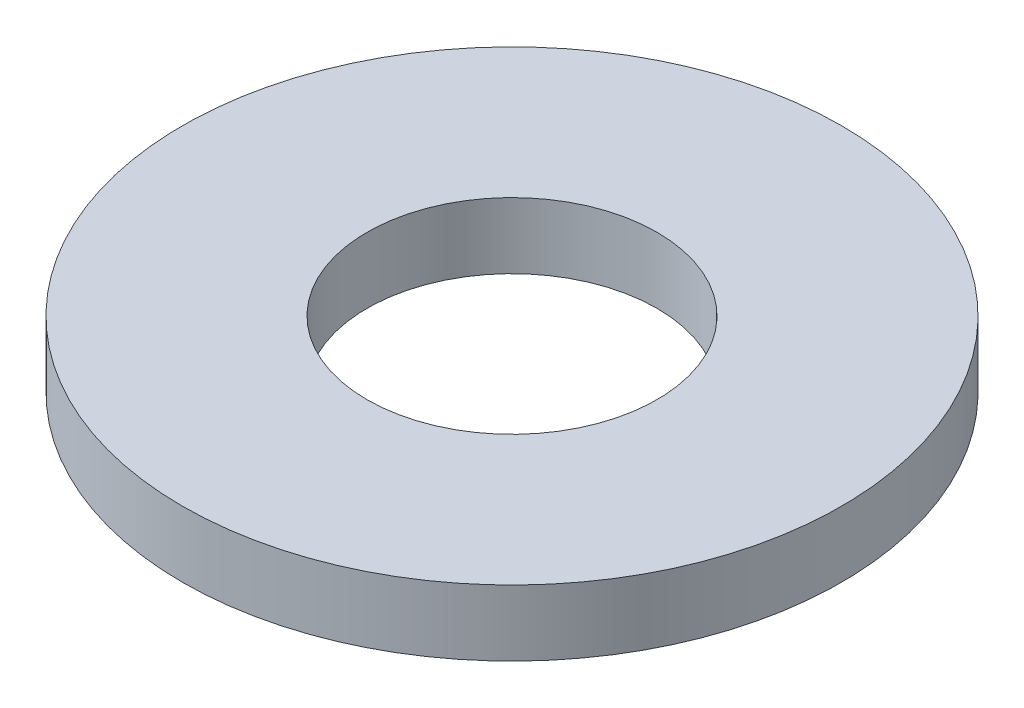
ISO-10303-21;
HEADER;
FILE_DESCRIPTION(('STEP AP214'),'2;1');
FILE_NAME('part.step','',(''),(''),'','','');
FILE_SCHEMA(('AUTOMOTIVE_DESIGN { 1 0 10303 214 1 1 1 1 }'));
ENDSEC;
DATA;
#1=APPLICATION_CONTEXT('core data for automotive mechanical design processes');
#2=APPLICATION_PROTOCOL_DEFINITION('international standard','automotive_design',2000,#1);
#3=PRODUCT_CONTEXT('',#1,'mechanical');
#4=PRODUCT('Part','Part','',(#3));
#5=PRODUCT_RELATED_PRODUCT_CATEGORY('part','',(#4));
#6=PRODUCT_DEFINITION_FORMATION('','',#4);
#7=PRODUCT_DEFINITION_CONTEXT('part definition',#1,'design');
#8=PRODUCT_DEFINITION('design','',#6,#7);
#9=PRODUCT_DEFINITION_SHAPE('','',#8);
#10=(LENGTH_UNIT() NAMED_UNIT(*) SI_UNIT(.MILLI.,.METRE.));
#11=(NAMED_UNIT(*) PLANE_ANGLE_UNIT() SI_UNIT($,.RADIAN.));
#12=(NAMED_UNIT(*) SI_UNIT($,.STERADIAN.) SOLID_ANGLE_UNIT());
#13=UNCERTAINTY_MEASURE_WITH_UNIT(LENGTH_MEASURE(1.E-05),#10,'distance_accuracy_value','');
#14=(GEOMETRIC_REPRESENTATION_CONTEXT(3) GLOBAL_UNCERTAINTY_ASSIGNED_CONTEXT((#13)) GLOBAL_UNIT_ASSIGNED_CONTEXT((#10,
#11,#12)) REPRESENTATION_CONTEXT('',''));
#15=CARTESIAN_POINT('',(0.,0.,0.));
#16=DIRECTION('',(0.,0.,1.));
#17=DIRECTION('',(1.,0.,0.));
#18=AXIS2_PLACEMENT_3D('',#15,#16,#17);
#19=CARTESIAN_POINT('',(0.,0.25,0.));
#20=DIRECTION('',(0.,1.,0.));
#21=DIRECTION('',(0.,0.,1.));
#22=AXIS2_PLACEMENT_3D('',#19,#20,#21);
#23=PLANE('',#22);
#24=CARTESIAN_POINT('',(0.,0.25,0.));
#25=DIRECTION('',(0.,1.,0.));
#26=DIRECTION('',(0.,0.,1.));
#27=AXIS2_PLACEMENT_3D('',#24,#25,#26);
#28=CIRCLE('',#27,2.5);
#29=CARTESIAN_POINT('',(0.,0.25,2.5));
#30=VERTEX_POINT('',#29);
#31=EDGE_CURVE('E10',#30,#30,#28,.T.);
#32=ORIENTED_EDGE('',*,*,#31,.T.);
#33=EDGE_LOOP('',(#32));
#34=FACE_BOUND('',#33,.T.);
#35=CARTESIAN_POINT('',(0.,0.25,0.));
#36=DIRECTION('',(0.,1.,0.));
#37=DIRECTION('',(0.,0.,1.));
#38=AXIS2_PLACEMENT_3D('',#35,#36,#37);
#39=CIRCLE('',#38,1.1);
#40=CARTESIAN_POINT('',(0.,0.25,1.1));
#41=VERTEX_POINT('',#40);
#42=EDGE_CURVE('E42',#41,#41,#39,.T.);
#43=ORIENTED_EDGE('',*,*,#42,.F.);
#44=EDGE_LOOP('',(#43));
#45=FACE_BOUND('',#44,.T.);
#46=ADVANCED_FACE('F31',(#34,#45),#23,.T.);
#47=CARTESIAN_POINT('',(0.,-0.25,0.));
#48=DIRECTION('',(0.,1.,0.));
#49=DIRECTION('',(0.,0.,1.));
#50=AXIS2_PLACEMENT_3D('',#47,#48,#49);
#51=PLANE('',#50);
#52=CARTESIAN_POINT('',(0.,-0.25,0.));
#53=DIRECTION('',(0.,1.,0.));
#54=DIRECTION('',(0.,0.,1.));
#55=AXIS2_PLACEMENT_3D('',#52,#53,#54);
#56=CIRCLE('',#55,2.5);
#57=CARTESIAN_POINT('',(0.,-0.25,2.5));
#58=VERTEX_POINT('',#57);
#59=EDGE_CURVE('E35',#58,#58,#56,.T.);
#60=ORIENTED_EDGE('',*,*,#59,.F.);
#61=EDGE_LOOP('',(#60));
#62=FACE_BOUND('',#61,.T.);
#63=CARTESIAN_POINT('',(0.,-0.25,0.));
#64=DIRECTION('',(0.,1.,0.));
#65=DIRECTION('',(0.,0.,1.));
#66=AXIS2_PLACEMENT_3D('',#63,#64,#65);
#67=CIRCLE('',#66,1.1);
#68=CARTESIAN_POINT('',(0.,-0.25,1.1));
#69=VERTEX_POINT('',#68);
#70=EDGE_CURVE('E44',#69,#69,#67,.T.);
#71=ORIENTED_EDGE('',*,*,#70,.T.);
#72=EDGE_LOOP('',(#71));
#73=FACE_BOUND('',#72,.T.);
#74=ADVANCED_FACE('F54',(#62,#73),#51,.F.);
#75=CARTESIAN_POINT('',(0.,0.25,0.));
#76=DIRECTION('',(0.,-1.,0.));
#77=DIRECTION('',(0.,0.,-1.));
#78=AXIS2_PLACEMENT_3D('',#75,#76,#77);
#79=CYLINDRICAL_SURFACE('',#78,2.5);
#80=ORIENTED_EDGE('',*,*,#31,.F.);
#81=EDGE_LOOP('',(#80));
#82=FACE_BOUND('',#81,.T.);
#83=ORIENTED_EDGE('',*,*,#59,.T.);
#84=EDGE_LOOP('',(#83));
#85=FACE_BOUND('',#84,.T.);
#86=ADVANCED_FACE('F33',(#82,#85),#79,.T.);
#87=CARTESIAN_POINT('',(0.,0.25,0.));
#88=DIRECTION('',(0.,-1.,0.));
#89=DIRECTION('',(0.,0.,-1.));
#90=AXIS2_PLACEMENT_3D('',#87,#88,#89);
#91=CYLINDRICAL_SURFACE('',#90,1.1);
#92=ORIENTED_EDGE('',*,*,#42,.T.);
#93=EDGE_LOOP('',(#92));
#94=FACE_BOUND('',#93,.T.);
#95=ORIENTED_EDGE('',*,*,#70,.F.);
#96=EDGE_LOOP('',(#95));
#97=FACE_BOUND('',#96,.T.);
#98=ADVANCED_FACE('F50',(#94,#97),#91,.F.);
#99=CLOSED_SHELL('',(#46,#74,#86,#98));
#100=MANIFOLD_SOLID_BREP('B2',#99);
#101=ADVANCED_BREP_SHAPE_REPRESENTATION('',(#18,#100),#14);
#102=SHAPE_DEFINITION_REPRESENTATION(#9,#101);
ENDSEC;
END-ISO-10303-21;
